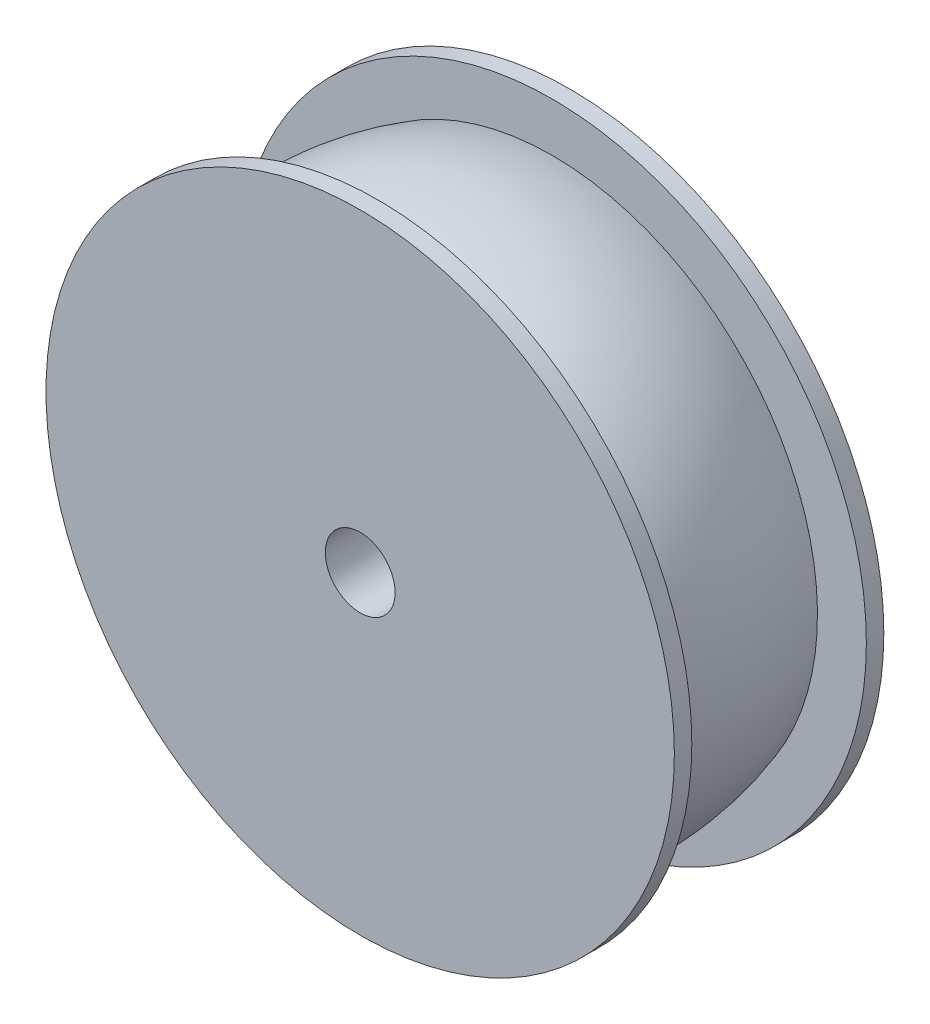
ISO-10303-21;
HEADER;
FILE_DESCRIPTION(('STEP AP214'),'2;1');
FILE_NAME('part.step','',(''),(''),'','','');
FILE_SCHEMA(('AUTOMOTIVE_DESIGN { 1 0 10303 214 1 1 1 1 }'));
ENDSEC;
DATA;
#1=APPLICATION_CONTEXT('core data for automotive mechanical design processes');
#2=APPLICATION_PROTOCOL_DEFINITION('international standard','automotive_design',2000,#1);
#3=PRODUCT_CONTEXT('',#1,'mechanical');
#4=PRODUCT('Part','Part','',(#3));
#5=PRODUCT_RELATED_PRODUCT_CATEGORY('part','',(#4));
#6=PRODUCT_DEFINITION_FORMATION('','',#4);
#7=PRODUCT_DEFINITION_CONTEXT('part definition',#1,'design');
#8=PRODUCT_DEFINITION('design','',#6,#7);
#9=PRODUCT_DEFINITION_SHAPE('','',#8);
#10=(LENGTH_UNIT() NAMED_UNIT(*) SI_UNIT(.MILLI.,.METRE.));
#11=(NAMED_UNIT(*) PLANE_ANGLE_UNIT() SI_UNIT($,.RADIAN.));
#12=(NAMED_UNIT(*) SI_UNIT($,.STERADIAN.) SOLID_ANGLE_UNIT());
#13=UNCERTAINTY_MEASURE_WITH_UNIT(LENGTH_MEASURE(1.E-05),#10,'distance_accuracy_value','');
#14=(GEOMETRIC_REPRESENTATION_CONTEXT(3) GLOBAL_UNCERTAINTY_ASSIGNED_CONTEXT((#13)) GLOBAL_UNIT_ASSIGNED_CONTEXT((#10,
#11,#12)) REPRESENTATION_CONTEXT('',''));
#15=CARTESIAN_POINT('',(0.,0.,0.));
#16=DIRECTION('',(0.,0.,1.));
#17=DIRECTION('',(1.,0.,0.));
#18=AXIS2_PLACEMENT_3D('',#15,#16,#17);
#19=CARTESIAN_POINT('',(0.,0.,-3.));
#20=DIRECTION('',(0.,0.,1.));
#21=DIRECTION('',(1.,0.,0.));
#22=AXIS2_PLACEMENT_3D('',#19,#20,#21);
#23=PLANE('',#22);
#24=CARTESIAN_POINT('',(0.,0.,-3.));
#25=DIRECTION('',(0.,0.,1.));
#26=DIRECTION('',(1.,0.,0.));
#27=AXIS2_PLACEMENT_3D('',#24,#25,#26);
#28=CIRCLE('',#27,1.);
#29=CARTESIAN_POINT('',(1.,0.,-3.));
#30=VERTEX_POINT('',#29);
#31=EDGE_CURVE('E56',#30,#30,#28,.T.);
#32=ORIENTED_EDGE('',*,*,#31,.T.);
#33=EDGE_LOOP('',(#32));
#34=FACE_BOUND('',#33,.T.);
#35=CARTESIAN_POINT('',(0.,0.,-3.));
#36=DIRECTION('',(0.,0.,1.));
#37=DIRECTION('',(1.,0.,0.));
#38=AXIS2_PLACEMENT_3D('',#35,#36,#37);
#39=CIRCLE('',#38,9.);
#40=CARTESIAN_POINT('',(9.,0.,-3.));
#41=VERTEX_POINT('',#40);
#42=EDGE_CURVE('E10',#41,#41,#39,.T.);
#43=ORIENTED_EDGE('',*,*,#42,.F.);
#44=EDGE_LOOP('',(#43));
#45=FACE_BOUND('',#44,.T.);
#46=ADVANCED_FACE('F31',(#34,#45),#23,.F.);
#47=CARTESIAN_POINT('',(0.,0.,8.0253203030883));
#48=DIRECTION('',(0.,0.,1.));
#49=DIRECTION('',(1.,0.,0.));
#50=AXIS2_PLACEMENT_3D('',#47,#48,#49);
#51=CYLINDRICAL_SURFACE('',#50,9.);
#52=CARTESIAN_POINT('',(0.,0.,-2.5));
#53=DIRECTION('',(0.,0.,1.));
#54=DIRECTION('',(1.,0.,0.));
#55=AXIS2_PLACEMENT_3D('',#52,#53,#54);
#56=CIRCLE('',#55,9.);
#57=CARTESIAN_POINT('',(9.,0.,-2.5));
#58=VERTEX_POINT('',#57);
#59=EDGE_CURVE('E37',#58,#58,#56,.T.);
#60=ORIENTED_EDGE('',*,*,#59,.F.);
#61=EDGE_LOOP('',(#60));
#62=FACE_BOUND('',#61,.T.);
#63=ORIENTED_EDGE('',*,*,#42,.T.);
#64=EDGE_LOOP('',(#63));
#65=FACE_BOUND('',#64,.T.);
#66=ADVANCED_FACE('F89',(#62,#65),#51,.T.);
#67=CARTESIAN_POINT('',(0.,0.,-2.5));
#68=DIRECTION('',(0.,0.,-1.));
#69=DIRECTION('',(-1.,0.,0.));
#70=AXIS2_PLACEMENT_3D('',#67,#68,#69);
#71=PLANE('',#70);
#72=CARTESIAN_POINT('',(0.,0.,-2.5));
#73=DIRECTION('',(0.,0.,1.));
#74=DIRECTION('',(1.,0.,0.));
#75=AXIS2_PLACEMENT_3D('',#72,#73,#74);
#76=CIRCLE('',#75,7.59934207678533);
#77=CARTESIAN_POINT('',(0.,7.59934207678533,-2.5));
#78=VERTEX_POINT('',#77);
#79=EDGE_CURVE('E41',#78,#78,#76,.T.);
#80=ORIENTED_EDGE('',*,*,#79,.F.);
#81=EDGE_LOOP('',(#80));
#82=FACE_BOUND('',#81,.T.);
#83=ORIENTED_EDGE('',*,*,#59,.T.);
#84=EDGE_LOOP('',(#83));
#85=FACE_BOUND('',#84,.T.);
#86=ADVANCED_FACE('F93',(#82,#85),#71,.F.);
#87=CARTESIAN_POINT('',(0.,0.,0.));
#88=DIRECTION('',(0.,0.,1.));
#89=DIRECTION('',(0.,1.,0.));
#90=AXIS2_PLACEMENT_3D('',#87,#88,#89);
#91=SPHERICAL_SURFACE('',#90,8.);
#92=CARTESIAN_POINT('',(0.,0.,2.5));
#93=DIRECTION('',(0.,0.,1.));
#94=DIRECTION('',(1.,0.,0.));
#95=AXIS2_PLACEMENT_3D('',#92,#93,#94);
#96=CIRCLE('',#95,7.59934207678533);
#97=CARTESIAN_POINT('',(0.,7.59934207678533,2.5));
#98=VERTEX_POINT('',#97);
#99=EDGE_CURVE('E45',#98,#98,#96,.T.);
#100=CARTESIAN_POINT('',(0.,7.59934207678533,2.5));
#101=CARTESIAN_POINT('',(0.,7.61589546594774,2.4496822917984));
#102=CARTESIAN_POINT('',(0.,7.63194896001459,2.39920013288402));
#103=CARTESIAN_POINT('',(0.,7.66305013680552,2.2979269282324));
#104=CARTESIAN_POINT('',(0.,7.6780978195296,2.24713588249517));
#105=CARTESIAN_POINT('',(0.,7.70718135248338,2.14526491880058));
#106=CARTESIAN_POINT('',(0.,7.72121720271307,2.09418500084323));
#107=CARTESIAN_POINT('',(0.,7.74827155509761,1.99175645394649));
#108=CARTESIAN_POINT('',(0.,7.76129005725245,1.94040782500709));
#109=CARTESIAN_POINT('',(0.,7.78630457082347,1.83746211465793));
#110=CARTESIAN_POINT('',(0.,7.79830058223965,1.78586503324816));
#111=CARTESIAN_POINT('',(0.,7.82126538274305,1.68244277684515));
#112=CARTESIAN_POINT('',(0.,7.83223417183027,1.6306176018519));
#113=CARTESIAN_POINT('',(0.,7.85314019934552,1.5267596065383));
#114=CARTESIAN_POINT('',(0.,7.86307743777355,1.47472678621795));
#115=CARTESIAN_POINT('',(0.,7.88191644320189,1.37047403060434));
#116=CARTESIAN_POINT('',(0.,7.8908182102022,1.31825409531109));
#117=CARTESIAN_POINT('',(0.,7.90758276042028,1.21364771388979));
#118=CARTESIAN_POINT('',(0.,7.91544554363804,1.16126126776175));
#119=CARTESIAN_POINT('',(0.,7.93012902392195,1.05634253452037));
#120=CARTESIAN_POINT('',(0.,7.93694972098809,1.00381024740704));
#121=CARTESIAN_POINT('',(0.,7.94954633775965,0.898620559585051));
#122=CARTESIAN_POINT('',(0.,7.95532225746506,0.845963158876399));
#123=CARTESIAN_POINT('',(0.,7.96582704054123,0.74054402062004));
#124=CARTESIAN_POINT('',(0.,7.97055590391198,0.687782283072333));
#125=CARTESIAN_POINT('',(0.,7.97896470847571,0.58217528906154));
#126=CARTESIAN_POINT('',(0.,7.98264464966867,0.529330032598453));
#127=CARTESIAN_POINT('',(0.,7.98895415790165,0.423576851634258));
#128=CARTESIAN_POINT('',(0.,7.99158372494167,0.37066892713315));
#129=CARTESIAN_POINT('',(0.,7.99579144733416,0.264811285696855));
#130=CARTESIAN_POINT('',(0.,7.99736960268665,0.211861568761669));
#131=CARTESIAN_POINT('',(0.,7.99947387901957,0.105941234550988));
#132=CARTESIAN_POINT('',(0.,8.,0.0529706172754938));
#133=CARTESIAN_POINT('',(0.,8.,-0.0529706172754947));
#134=CARTESIAN_POINT('',(0.,7.99947387901957,-0.105941234550989));
#135=CARTESIAN_POINT('',(0.,7.99736960268665,-0.211861568761669));
#136=CARTESIAN_POINT('',(0.,7.99579144733416,-0.264811285696856));
#137=CARTESIAN_POINT('',(0.,7.99158372494167,-0.37066892713315));
#138=CARTESIAN_POINT('',(0.,7.98895415790165,-0.423576851634259));
#139=CARTESIAN_POINT('',(0.,7.98264464966867,-0.529330032598454));
#140=CARTESIAN_POINT('',(0.,7.97896470847571,-0.582175289061541));
#141=CARTESIAN_POINT('',(0.,7.97055590391198,-0.687782283072334));
#142=CARTESIAN_POINT('',(0.,7.96582704054123,-0.74054402062004));
#143=CARTESIAN_POINT('',(0.,7.95532225746506,-0.8459631588764));
#144=CARTESIAN_POINT('',(0.,7.94954633775965,-0.898620559585052));
#145=CARTESIAN_POINT('',(0.,7.93694972098809,-1.00381024740704));
#146=CARTESIAN_POINT('',(0.,7.93012902392195,-1.05634253452038));
#147=CARTESIAN_POINT('',(0.,7.91544554363804,-1.16126126776175));
#148=CARTESIAN_POINT('',(0.,7.90758276042028,-1.21364771388979));
#149=CARTESIAN_POINT('',(0.,7.8908182102022,-1.31825409531109));
#150=CARTESIAN_POINT('',(0.,7.88191644320189,-1.37047403060434));
#151=CARTESIAN_POINT('',(0.,7.86307743777355,-1.47472678621795));
#152=CARTESIAN_POINT('',(0.,7.85314019934552,-1.5267596065383));
#153=CARTESIAN_POINT('',(0.,7.83223417183027,-1.63061760185191));
#154=CARTESIAN_POINT('',(0.,7.82126538274304,-1.68244277684515));
#155=CARTESIAN_POINT('',(0.,7.79830058223965,-1.78586503324816));
#156=CARTESIAN_POINT('',(0.,7.78630457082347,-1.83746211465793));
#157=CARTESIAN_POINT('',(0.,7.76129005725245,-1.94040782500709));
#158=CARTESIAN_POINT('',(0.,7.74827155509761,-1.99175645394649));
#159=CARTESIAN_POINT('',(0.,7.72121720271307,-2.09418500084323));
#160=CARTESIAN_POINT('',(0.,7.70718135248338,-2.14526491880058));
#161=CARTESIAN_POINT('',(0.,7.6780978195296,-2.24713588249517));
#162=CARTESIAN_POINT('',(0.,7.66305013680552,-2.2979269282324));
#163=CARTESIAN_POINT('',(0.,7.63194896001459,-2.39920013288402));
#164=CARTESIAN_POINT('',(0.,7.61589546594774,-2.4496822917984));
#165=CARTESIAN_POINT('',(0.,7.59934207678533,-2.5));
#166=B_SPLINE_CURVE_WITH_KNOTS('',3,(#100,#101,#102,#103,#104,#105,#106,#107,#108,#109,#110,
#111,#112,#113,#114,#115,#116,#117,#118,#119,#120,#121,#122,#123,#124,#125,#126,#127,#128,#129,
#130,#131,#132,#133,#134,#135,#136,#137,#138,#139,#140,#141,#142,#143,#144,#145,#146,#147,#148,
#149,#150,#151,#152,#153,#154,#155,#156,#157,#158,#159,#160,#161,#162,#163,#164,#165),
.UNSPECIFIED.,.F.,.F.,(4,2,2,2,2,2,2,2,2,2,2,2,2,2,2,2,2,2,2,2,2,2,2,2,2,2,2,2,2,2,2,2,4),(0.,
0.15890923934838,0.317818478696759,0.476727718045139,0.635636957393519,0.794546196741899,
0.953455436090278,1.11236467543866,1.27127391478704,1.43018315413542,1.5890923934838,
1.74800163283218,1.90691087218056,2.06582011152894,2.22472935087732,2.3836385902257,
2.54254782957408,2.70145706892245,2.86036630827083,3.01927554761921,3.17818478696759,
3.33709402631597,3.49600326566435,3.65491250501273,3.81382174436111,3.97273098370949,
4.13164022305787,4.29054946240625,4.44945870175463,4.60836794110301,4.76727718045139,
4.92618641979977,5.08509565914815),.UNSPECIFIED.);
#167=EDGE_CURVE('BSEAM85',#98,#78,#166,.T.);
#168=ORIENTED_EDGE('',*,*,#99,.F.);
#169=ORIENTED_EDGE('',*,*,#79,.T.);
#170=ORIENTED_EDGE('',*,*,#167,.T.);
#171=ORIENTED_EDGE('',*,*,#167,.F.);
#172=EDGE_LOOP('',(#168,#170,#169,#171));
#173=FACE_BOUND('',#172,.T.);
#174=ADVANCED_FACE('F85',(#173),#91,.T.);
#175=CARTESIAN_POINT('',(0.,0.,2.5));
#176=DIRECTION('',(0.,0.,-1.));
#177=DIRECTION('',(-1.,0.,0.));
#178=AXIS2_PLACEMENT_3D('',#175,#176,#177);
#179=PLANE('',#178);
#180=ORIENTED_EDGE('',*,*,#99,.T.);
#181=EDGE_LOOP('',(#180));
#182=FACE_BOUND('',#181,.T.);
#183=CARTESIAN_POINT('',(0.,0.,2.5));
#184=DIRECTION('',(0.,0.,1.));
#185=DIRECTION('',(1.,0.,0.));
#186=AXIS2_PLACEMENT_3D('',#183,#184,#185);
#187=CIRCLE('',#186,9.);
#188=CARTESIAN_POINT('',(9.,0.,2.5));
#189=VERTEX_POINT('',#188);
#190=EDGE_CURVE('E50',#189,#189,#187,.T.);
#191=ORIENTED_EDGE('',*,*,#190,.F.);
#192=EDGE_LOOP('',(#191));
#193=FACE_BOUND('',#192,.T.);
#194=ADVANCED_FACE('F79',(#182,#193),#179,.T.);
#195=CARTESIAN_POINT('',(0.,0.,8.0253203030883));
#196=DIRECTION('',(0.,0.,1.));
#197=DIRECTION('',(1.,0.,0.));
#198=AXIS2_PLACEMENT_3D('',#195,#196,#197);
#199=CYLINDRICAL_SURFACE('',#198,9.);
#200=ORIENTED_EDGE('',*,*,#190,.T.);
#201=EDGE_LOOP('',(#200));
#202=FACE_BOUND('',#201,.T.);
#203=CARTESIAN_POINT('',(0.,0.,3.));
#204=DIRECTION('',(0.,0.,1.));
#205=DIRECTION('',(1.,0.,0.));
#206=AXIS2_PLACEMENT_3D('',#203,#204,#205);
#207=CIRCLE('',#206,9.);
#208=CARTESIAN_POINT('',(9.,0.,3.));
#209=VERTEX_POINT('',#208);
#210=EDGE_CURVE('E53',#209,#209,#207,.T.);
#211=ORIENTED_EDGE('',*,*,#210,.F.);
#212=EDGE_LOOP('',(#211));
#213=FACE_BOUND('',#212,.T.);
#214=ADVANCED_FACE('F74',(#202,#213),#199,.T.);
#215=CARTESIAN_POINT('',(0.,0.,3.));
#216=DIRECTION('',(0.,0.,1.));
#217=DIRECTION('',(1.,0.,0.));
#218=AXIS2_PLACEMENT_3D('',#215,#216,#217);
#219=PLANE('',#218);
#220=CARTESIAN_POINT('',(0.,0.,3.));
#221=DIRECTION('',(0.,0.,1.));
#222=DIRECTION('',(1.,0.,0.));
#223=AXIS2_PLACEMENT_3D('',#220,#221,#222);
#224=CIRCLE('',#223,1.);
#225=CARTESIAN_POINT('',(1.,0.,3.));
#226=VERTEX_POINT('',#225);
#227=EDGE_CURVE('E57',#226,#226,#224,.T.);
#228=ORIENTED_EDGE('',*,*,#227,.F.);
#229=EDGE_LOOP('',(#228));
#230=FACE_BOUND('',#229,.T.);
#231=ORIENTED_EDGE('',*,*,#210,.T.);
#232=EDGE_LOOP('',(#231));
#233=FACE_BOUND('',#232,.T.);
#234=ADVANCED_FACE('F68',(#230,#233),#219,.T.);
#235=CARTESIAN_POINT('',(0.,0.,-3.));
#236=DIRECTION('',(0.,0.,1.));
#237=DIRECTION('',(1.,0.,0.));
#238=AXIS2_PLACEMENT_3D('',#235,#236,#237);
#239=CYLINDRICAL_SURFACE('',#238,1.);
#240=ORIENTED_EDGE('',*,*,#31,.F.);
#241=EDGE_LOOP('',(#240));
#242=FACE_BOUND('',#241,.T.);
#243=ORIENTED_EDGE('',*,*,#227,.T.);
#244=EDGE_LOOP('',(#243));
#245=FACE_BOUND('',#244,.T.);
#246=ADVANCED_FACE('F65',(#242,#245),#239,.F.);
#247=CLOSED_SHELL('',(#46,#66,#86,#174,#194,#214,#234,#246));
#248=MANIFOLD_SOLID_BREP('B2',#247);
#249=ADVANCED_BREP_SHAPE_REPRESENTATION('',(#18,#248),#14);
#250=SHAPE_DEFINITION_REPRESENTATION(#9,#249);
ENDSEC;
END-ISO-10303-21;
